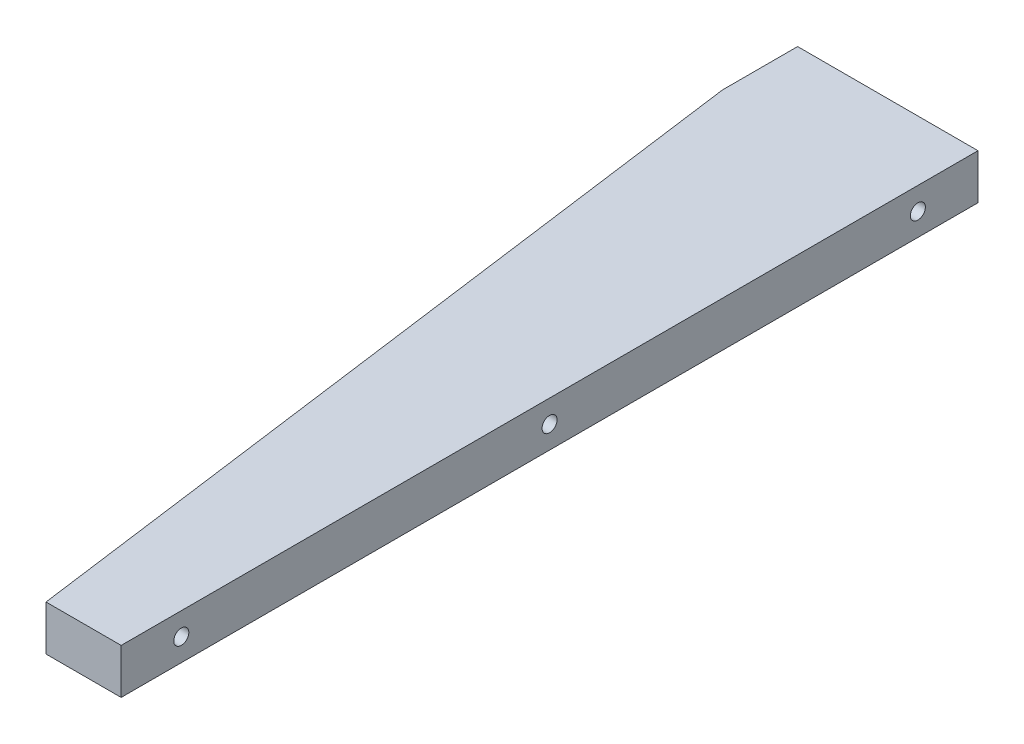
ISO-10303-21;
HEADER;
FILE_DESCRIPTION(('STEP AP214'),'2;1');
FILE_NAME('part.step','',(''),(''),'','','');
FILE_SCHEMA(('AUTOMOTIVE_DESIGN { 1 0 10303 214 1 1 1 1 }'));
ENDSEC;
DATA;
#1=APPLICATION_CONTEXT('core data for automotive mechanical design processes');
#2=APPLICATION_PROTOCOL_DEFINITION('international standard','automotive_design',2000,#1);
#3=PRODUCT_CONTEXT('',#1,'mechanical');
#4=PRODUCT('Part','Part','',(#3));
#5=PRODUCT_RELATED_PRODUCT_CATEGORY('part','',(#4));
#6=PRODUCT_DEFINITION_FORMATION('','',#4);
#7=PRODUCT_DEFINITION_CONTEXT('part definition',#1,'design');
#8=PRODUCT_DEFINITION('design','',#6,#7);
#9=PRODUCT_DEFINITION_SHAPE('','',#8);
#10=(LENGTH_UNIT() NAMED_UNIT(*) SI_UNIT(.MILLI.,.METRE.));
#11=(NAMED_UNIT(*) PLANE_ANGLE_UNIT() SI_UNIT($,.RADIAN.));
#12=(NAMED_UNIT(*) SI_UNIT($,.STERADIAN.) SOLID_ANGLE_UNIT());
#13=UNCERTAINTY_MEASURE_WITH_UNIT(LENGTH_MEASURE(1.E-05),#10,'distance_accuracy_value','');
#14=(GEOMETRIC_REPRESENTATION_CONTEXT(3) GLOBAL_UNCERTAINTY_ASSIGNED_CONTEXT((#13)) GLOBAL_UNIT_ASSIGNED_CONTEXT((#10,
#11,#12)) REPRESENTATION_CONTEXT('',''));
#15=CARTESIAN_POINT('',(0.,0.,0.));
#16=DIRECTION('',(0.,0.,1.));
#17=DIRECTION('',(1.,0.,0.));
#18=AXIS2_PLACEMENT_3D('',#15,#16,#17);
#19=CARTESIAN_POINT('',(-60.,15.,0.));
#20=DIRECTION('',(0.,0.,1.));
#21=DIRECTION('',(1.,0.,0.));
#22=AXIS2_PLACEMENT_3D('',#19,#20,#21);
#23=PLANE('',#22);
#24=CARTESIAN_POINT('',(-45.,7.5,0.));
#25=DIRECTION('',(0.,0.,-1.));
#26=DIRECTION('',(-1.,0.,0.));
#27=AXIS2_PLACEMENT_3D('',#24,#25,#26);
#28=CIRCLE('',#27,2.5);
#29=CARTESIAN_POINT('',(-47.5,7.5,0.));
#30=VERTEX_POINT('',#29);
#31=EDGE_CURVE('E151',#30,#30,#28,.T.);
#32=ORIENTED_EDGE('',*,*,#31,.F.);
#33=EDGE_LOOP('',(#32));
#34=FACE_BOUND('',#33,.T.);
#35=DIRECTION('',(-1.,0.,0.));
#36=VECTOR('',#35,1.);
#37=CARTESIAN_POINT('',(-60.,0.,0.));
#38=LINE('',#37,#36);
#39=CARTESIAN_POINT('',(0.,0.,0.));
#40=VERTEX_POINT('',#39);
#41=CARTESIAN_POINT('',(-60.,0.,0.));
#42=VERTEX_POINT('',#41);
#43=EDGE_CURVE('E113',#40,#42,#38,.T.);
#44=ORIENTED_EDGE('',*,*,#43,.T.);
#45=DIRECTION('',(0.,-1.,0.));
#46=VECTOR('',#45,1.);
#47=CARTESIAN_POINT('',(-60.,15.,0.));
#48=LINE('',#47,#46);
#49=CARTESIAN_POINT('',(-60.,15.,0.));
#50=VERTEX_POINT('',#49);
#51=EDGE_CURVE('E11',#50,#42,#48,.T.);
#52=ORIENTED_EDGE('',*,*,#51,.F.);
#53=DIRECTION('',(-1.,0.,0.));
#54=VECTOR('',#53,1.);
#55=CARTESIAN_POINT('',(-60.,15.,0.));
#56=LINE('',#55,#54);
#57=CARTESIAN_POINT('',(0.,15.,0.));
#58=VERTEX_POINT('',#57);
#59=EDGE_CURVE('E122',#58,#50,#56,.T.);
#60=ORIENTED_EDGE('',*,*,#59,.F.);
#61=DIRECTION('',(0.,-1.,0.));
#62=VECTOR('',#61,1.);
#63=CARTESIAN_POINT('',(0.,15.,0.));
#64=LINE('',#63,#62);
#65=EDGE_CURVE('E109',#58,#40,#64,.T.);
#66=ORIENTED_EDGE('',*,*,#65,.T.);
#67=EDGE_LOOP('',(#44,#52,#60,#66));
#68=FACE_BOUND('',#67,.T.);
#69=ADVANCED_FACE('F36',(#34,#68),#23,.F.);
#70=CARTESIAN_POINT('',(-60.,15.,25.));
#71=DIRECTION('',(1.,0.,0.));
#72=DIRECTION('',(0.,0.,-1.));
#73=AXIS2_PLACEMENT_3D('',#70,#71,#72);
#74=PLANE('',#73);
#75=DIRECTION('',(0.,0.,1.));
#76=VECTOR('',#75,1.);
#77=CARTESIAN_POINT('',(-60.,0.,25.));
#78=LINE('',#77,#76);
#79=CARTESIAN_POINT('',(-60.,0.,25.));
#80=VERTEX_POINT('',#79);
#81=EDGE_CURVE('E116',#42,#80,#78,.T.);
#82=ORIENTED_EDGE('',*,*,#81,.T.);
#83=DIRECTION('',(0.,-1.,0.));
#84=VECTOR('',#83,1.);
#85=CARTESIAN_POINT('',(-60.,15.,25.));
#86=LINE('',#85,#84);
#87=CARTESIAN_POINT('',(-60.,15.,25.));
#88=VERTEX_POINT('',#87);
#89=EDGE_CURVE('E44',#88,#80,#86,.T.);
#90=ORIENTED_EDGE('',*,*,#89,.F.);
#91=DIRECTION('',(0.,0.,1.));
#92=VECTOR('',#91,1.);
#93=CARTESIAN_POINT('',(-60.,15.,25.));
#94=LINE('',#93,#92);
#95=EDGE_CURVE('E87',#50,#88,#94,.T.);
#96=ORIENTED_EDGE('',*,*,#95,.F.);
#97=ORIENTED_EDGE('',*,*,#51,.T.);
#98=EDGE_LOOP('',(#82,#90,#96,#97));
#99=FACE_BOUND('',#98,.T.);
#100=ADVANCED_FACE('F144',(#99),#74,.F.);
#101=CARTESIAN_POINT('',(-25.,15.,285.));
#102=DIRECTION('',(0.991060661622862,0.,-0.133412012141539));
#103=DIRECTION('',(-0.133412012141539,0.,-0.991060661622863));
#104=AXIS2_PLACEMENT_3D('',#101,#102,#103);
#105=PLANE('',#104);
#106=DIRECTION('',(0.133412012141539,0.,0.991060661622862));
#107=VECTOR('',#106,1.);
#108=CARTESIAN_POINT('',(-25.,0.,285.));
#109=LINE('',#108,#107);
#110=CARTESIAN_POINT('',(-25.,0.,285.));
#111=VERTEX_POINT('',#110);
#112=EDGE_CURVE('E104',#80,#111,#109,.T.);
#113=ORIENTED_EDGE('',*,*,#112,.T.);
#114=DIRECTION('',(0.,-1.,0.));
#115=VECTOR('',#114,1.);
#116=CARTESIAN_POINT('',(-25.,15.,285.));
#117=LINE('',#116,#115);
#118=CARTESIAN_POINT('',(-25.,15.,285.));
#119=VERTEX_POINT('',#118);
#120=EDGE_CURVE('E101',#119,#111,#117,.T.);
#121=ORIENTED_EDGE('',*,*,#120,.F.);
#122=DIRECTION('',(0.133412012141539,0.,0.991060661622862));
#123=VECTOR('',#122,1.);
#124=CARTESIAN_POINT('',(-25.,15.,285.));
#125=LINE('',#124,#123);
#126=EDGE_CURVE('E93',#88,#119,#125,.T.);
#127=ORIENTED_EDGE('',*,*,#126,.F.);
#128=ORIENTED_EDGE('',*,*,#89,.T.);
#129=EDGE_LOOP('',(#113,#121,#127,#128));
#130=FACE_BOUND('',#129,.T.);
#131=ADVANCED_FACE('F102',(#130),#105,.F.);
#132=CARTESIAN_POINT('',(0.,15.,285.));
#133=DIRECTION('',(0.,0.,-1.));
#134=DIRECTION('',(-1.,0.,0.));
#135=AXIS2_PLACEMENT_3D('',#132,#133,#134);
#136=PLANE('',#135);
#137=DIRECTION('',(1.,0.,0.));
#138=VECTOR('',#137,1.);
#139=CARTESIAN_POINT('',(0.,0.,285.));
#140=LINE('',#139,#138);
#141=CARTESIAN_POINT('',(0.,0.,285.));
#142=VERTEX_POINT('',#141);
#143=EDGE_CURVE('E73',#111,#142,#140,.T.);
#144=ORIENTED_EDGE('',*,*,#143,.T.);
#145=DIRECTION('',(0.,-1.,0.));
#146=VECTOR('',#145,1.);
#147=CARTESIAN_POINT('',(0.,15.,285.));
#148=LINE('',#147,#146);
#149=CARTESIAN_POINT('',(0.,15.,285.));
#150=VERTEX_POINT('',#149);
#151=EDGE_CURVE('E105',#150,#142,#148,.T.);
#152=ORIENTED_EDGE('',*,*,#151,.F.);
#153=DIRECTION('',(1.,0.,0.));
#154=VECTOR('',#153,1.);
#155=CARTESIAN_POINT('',(0.,15.,285.));
#156=LINE('',#155,#154);
#157=EDGE_CURVE('E97',#119,#150,#156,.T.);
#158=ORIENTED_EDGE('',*,*,#157,.F.);
#159=ORIENTED_EDGE('',*,*,#120,.T.);
#160=EDGE_LOOP('',(#144,#152,#158,#159));
#161=FACE_BOUND('',#160,.T.);
#162=ADVANCED_FACE('F107',(#161),#136,.F.);
#163=CARTESIAN_POINT('',(0.,15.,0.));
#164=DIRECTION('',(-1.,0.,0.));
#165=DIRECTION('',(0.,0.,1.));
#166=AXIS2_PLACEMENT_3D('',#163,#164,#165);
#167=PLANE('',#166);
#168=CARTESIAN_POINT('',(0.,7.5,265.));
#169=DIRECTION('',(1.,0.,0.));
#170=DIRECTION('',(0.,0.,-1.));
#171=AXIS2_PLACEMENT_3D('',#168,#169,#170);
#172=CIRCLE('',#171,2.49999999999999);
#173=CARTESIAN_POINT('',(0.,7.5,262.5));
#174=VERTEX_POINT('',#173);
#175=EDGE_CURVE('E173',#174,#174,#172,.T.);
#176=ORIENTED_EDGE('',*,*,#175,.F.);
#177=EDGE_LOOP('',(#176));
#178=FACE_BOUND('',#177,.T.);
#179=CARTESIAN_POINT('',(0.,7.5,142.5));
#180=DIRECTION('',(1.,0.,0.));
#181=DIRECTION('',(0.,0.,-1.));
#182=AXIS2_PLACEMENT_3D('',#179,#180,#181);
#183=CIRCLE('',#182,2.49999999999999);
#184=CARTESIAN_POINT('',(0.,7.5,140.));
#185=VERTEX_POINT('',#184);
#186=EDGE_CURVE('E167',#185,#185,#183,.T.);
#187=ORIENTED_EDGE('',*,*,#186,.F.);
#188=EDGE_LOOP('',(#187));
#189=FACE_BOUND('',#188,.T.);
#190=CARTESIAN_POINT('',(0.,7.5,20.));
#191=DIRECTION('',(1.,0.,0.));
#192=DIRECTION('',(0.,0.,-1.));
#193=AXIS2_PLACEMENT_3D('',#190,#191,#192);
#194=CIRCLE('',#193,2.49999999999999);
#195=CARTESIAN_POINT('',(0.,7.5,17.5));
#196=VERTEX_POINT('',#195);
#197=EDGE_CURVE('E158',#196,#196,#194,.T.);
#198=ORIENTED_EDGE('',*,*,#197,.F.);
#199=EDGE_LOOP('',(#198));
#200=FACE_BOUND('',#199,.T.);
#201=DIRECTION('',(0.,0.,-1.));
#202=VECTOR('',#201,1.);
#203=CARTESIAN_POINT('',(0.,0.,0.));
#204=LINE('',#203,#202);
#205=EDGE_CURVE('E79',#142,#40,#204,.T.);
#206=ORIENTED_EDGE('',*,*,#205,.T.);
#207=ORIENTED_EDGE('',*,*,#65,.F.);
#208=DIRECTION('',(0.,0.,-1.));
#209=VECTOR('',#208,1.);
#210=CARTESIAN_POINT('',(0.,15.,0.));
#211=LINE('',#210,#209);
#212=EDGE_CURVE('E52',#150,#58,#211,.T.);
#213=ORIENTED_EDGE('',*,*,#212,.F.);
#214=ORIENTED_EDGE('',*,*,#151,.T.);
#215=EDGE_LOOP('',(#206,#207,#213,#214));
#216=FACE_BOUND('',#215,.T.);
#217=ADVANCED_FACE('F130',(#178,#189,#200,#216),#167,.F.);
#218=CARTESIAN_POINT('',(0.,15.,0.));
#219=DIRECTION('',(0.,-1.,0.));
#220=DIRECTION('',(0.,0.,-1.));
#221=AXIS2_PLACEMENT_3D('',#218,#219,#220);
#222=PLANE('',#221);
#223=ORIENTED_EDGE('',*,*,#59,.T.);
#224=ORIENTED_EDGE('',*,*,#95,.T.);
#225=ORIENTED_EDGE('',*,*,#126,.T.);
#226=ORIENTED_EDGE('',*,*,#157,.T.);
#227=ORIENTED_EDGE('',*,*,#212,.T.);
#228=EDGE_LOOP('',(#223,#224,#225,#226,#227));
#229=FACE_BOUND('',#228,.T.);
#230=ADVANCED_FACE('F95',(#229),#222,.F.);
#231=CARTESIAN_POINT('',(0.,0.,0.));
#232=DIRECTION('',(0.,-1.,0.));
#233=DIRECTION('',(0.,0.,-1.));
#234=AXIS2_PLACEMENT_3D('',#231,#232,#233);
#235=PLANE('',#234);
#236=ORIENTED_EDGE('',*,*,#43,.F.);
#237=ORIENTED_EDGE('',*,*,#205,.F.);
#238=ORIENTED_EDGE('',*,*,#143,.F.);
#239=ORIENTED_EDGE('',*,*,#112,.F.);
#240=ORIENTED_EDGE('',*,*,#81,.F.);
#241=EDGE_LOOP('',(#236,#237,#238,#239,#240));
#242=FACE_BOUND('',#241,.T.);
#243=ADVANCED_FACE('F126',(#242),#235,.T.);
#244=CARTESIAN_POINT('',(-45.,7.5,10.));
#245=DIRECTION('',(0.,0.,-1.));
#246=DIRECTION('',(-1.,0.,0.));
#247=AXIS2_PLACEMENT_3D('',#244,#245,#246);
#248=CONICAL_SURFACE('',#247,2.5,1.02974425867665);
#249=CARTESIAN_POINT('',(-45.,7.5,11.5021515475689));
#250=VERTEX_POINT('',#249);
#251=VERTEX_LOOP('',#250);
#252=FACE_BOUND('',#251,.T.);
#253=CARTESIAN_POINT('',(-45.,7.5,10.));
#254=DIRECTION('',(0.,0.,-1.));
#255=DIRECTION('',(-1.,0.,0.));
#256=AXIS2_PLACEMENT_3D('',#253,#254,#255);
#257=CIRCLE('',#256,2.5);
#258=CARTESIAN_POINT('',(-47.5,7.5,10.));
#259=VERTEX_POINT('',#258);
#260=EDGE_CURVE('E117',#259,#259,#257,.T.);
#261=ORIENTED_EDGE('',*,*,#260,.T.);
#262=EDGE_LOOP('',(#261));
#263=FACE_BOUND('',#262,.T.);
#264=ADVANCED_FACE('F207',(#252,#263),#248,.F.);
#265=CARTESIAN_POINT('',(-45.,7.5,0.));
#266=DIRECTION('',(0.,0.,-1.));
#267=DIRECTION('',(-1.,0.,0.));
#268=AXIS2_PLACEMENT_3D('',#265,#266,#267);
#269=CYLINDRICAL_SURFACE('',#268,2.5);
#270=ORIENTED_EDGE('',*,*,#260,.F.);
#271=EDGE_LOOP('',(#270));
#272=FACE_BOUND('',#271,.T.);
#273=ORIENTED_EDGE('',*,*,#31,.T.);
#274=EDGE_LOOP('',(#273));
#275=FACE_BOUND('',#274,.T.);
#276=ADVANCED_FACE('F203',(#272,#275),#269,.F.);
#277=CARTESIAN_POINT('',(-9.99999999999999,7.5,20.));
#278=DIRECTION('',(1.,0.,0.));
#279=DIRECTION('',(0.,0.,-1.));
#280=AXIS2_PLACEMENT_3D('',#277,#278,#279);
#281=CONICAL_SURFACE('',#280,2.49999999999999,1.02974425867665);
#282=CARTESIAN_POINT('',(-11.5021515475689,7.5,20.));
#283=VERTEX_POINT('',#282);
#284=VERTEX_LOOP('',#283);
#285=FACE_BOUND('',#284,.T.);
#286=CARTESIAN_POINT('',(-9.99999999999999,7.5,20.));
#287=DIRECTION('',(1.,0.,0.));
#288=DIRECTION('',(0.,0.,-1.));
#289=AXIS2_PLACEMENT_3D('',#286,#287,#288);
#290=CIRCLE('',#289,2.49999999999999);
#291=CARTESIAN_POINT('',(-9.99999999999999,7.5,17.5));
#292=VERTEX_POINT('',#291);
#293=EDGE_CURVE('E153',#292,#292,#290,.T.);
#294=ORIENTED_EDGE('',*,*,#293,.T.);
#295=EDGE_LOOP('',(#294));
#296=FACE_BOUND('',#295,.T.);
#297=ADVANCED_FACE('F199',(#285,#296),#281,.F.);
#298=CARTESIAN_POINT('',(0.,7.5,20.));
#299=DIRECTION('',(1.,0.,0.));
#300=DIRECTION('',(0.,0.,-1.));
#301=AXIS2_PLACEMENT_3D('',#298,#299,#300);
#302=CYLINDRICAL_SURFACE('',#301,2.49999999999999);
#303=ORIENTED_EDGE('',*,*,#293,.F.);
#304=EDGE_LOOP('',(#303));
#305=FACE_BOUND('',#304,.T.);
#306=ORIENTED_EDGE('',*,*,#197,.T.);
#307=EDGE_LOOP('',(#306));
#308=FACE_BOUND('',#307,.T.);
#309=ADVANCED_FACE('F195',(#305,#308),#302,.F.);
#310=CARTESIAN_POINT('',(-9.99999999999998,7.5,142.5));
#311=DIRECTION('',(1.,0.,0.));
#312=DIRECTION('',(0.,0.,-1.));
#313=AXIS2_PLACEMENT_3D('',#310,#311,#312);
#314=CONICAL_SURFACE('',#313,2.49999999999999,1.02974425867665);
#315=CARTESIAN_POINT('',(-11.5021515475689,7.5,142.5));
#316=VERTEX_POINT('',#315);
#317=VERTEX_LOOP('',#316);
#318=FACE_BOUND('',#317,.T.);
#319=CARTESIAN_POINT('',(-9.99999999999998,7.5,142.5));
#320=DIRECTION('',(1.,0.,0.));
#321=DIRECTION('',(0.,0.,-1.));
#322=AXIS2_PLACEMENT_3D('',#319,#320,#321);
#323=CIRCLE('',#322,2.49999999999999);
#324=CARTESIAN_POINT('',(-9.99999999999998,7.5,140.));
#325=VERTEX_POINT('',#324);
#326=EDGE_CURVE('E164',#325,#325,#323,.T.);
#327=ORIENTED_EDGE('',*,*,#326,.T.);
#328=EDGE_LOOP('',(#327));
#329=FACE_BOUND('',#328,.T.);
#330=ADVANCED_FACE('F191',(#318,#329),#314,.F.);
#331=CARTESIAN_POINT('',(0.,7.5,142.5));
#332=DIRECTION('',(1.,0.,0.));
#333=DIRECTION('',(0.,0.,-1.));
#334=AXIS2_PLACEMENT_3D('',#331,#332,#333);
#335=CYLINDRICAL_SURFACE('',#334,2.49999999999999);
#336=ORIENTED_EDGE('',*,*,#326,.F.);
#337=EDGE_LOOP('',(#336));
#338=FACE_BOUND('',#337,.T.);
#339=ORIENTED_EDGE('',*,*,#186,.T.);
#340=EDGE_LOOP('',(#339));
#341=FACE_BOUND('',#340,.T.);
#342=ADVANCED_FACE('F184',(#338,#341),#335,.F.);
#343=CARTESIAN_POINT('',(-9.99999999999996,7.5,265.));
#344=DIRECTION('',(1.,0.,0.));
#345=DIRECTION('',(0.,0.,-1.));
#346=AXIS2_PLACEMENT_3D('',#343,#344,#345);
#347=CONICAL_SURFACE('',#346,2.49999999999999,1.02974425867665);
#348=CARTESIAN_POINT('',(-11.5021515475689,7.5,265.));
#349=VERTEX_POINT('',#348);
#350=VERTEX_LOOP('',#349);
#351=FACE_BOUND('',#350,.T.);
#352=CARTESIAN_POINT('',(-9.99999999999996,7.5,265.));
#353=DIRECTION('',(1.,0.,0.));
#354=DIRECTION('',(0.,0.,-1.));
#355=AXIS2_PLACEMENT_3D('',#352,#353,#354);
#356=CIRCLE('',#355,2.49999999999999);
#357=CARTESIAN_POINT('',(-9.99999999999996,7.5,262.5));
#358=VERTEX_POINT('',#357);
#359=EDGE_CURVE('E170',#358,#358,#356,.T.);
#360=ORIENTED_EDGE('',*,*,#359,.T.);
#361=EDGE_LOOP('',(#360));
#362=FACE_BOUND('',#361,.T.);
#363=ADVANCED_FACE('F178',(#351,#362),#347,.F.);
#364=CARTESIAN_POINT('',(0.,7.5,265.));
#365=DIRECTION('',(1.,0.,0.));
#366=DIRECTION('',(0.,0.,-1.));
#367=AXIS2_PLACEMENT_3D('',#364,#365,#366);
#368=CYLINDRICAL_SURFACE('',#367,2.49999999999999);
#369=ORIENTED_EDGE('',*,*,#359,.F.);
#370=EDGE_LOOP('',(#369));
#371=FACE_BOUND('',#370,.T.);
#372=ORIENTED_EDGE('',*,*,#175,.T.);
#373=EDGE_LOOP('',(#372));
#374=FACE_BOUND('',#373,.T.);
#375=ADVANCED_FACE('F176',(#371,#374),#368,.F.);
#376=CLOSED_SHELL('',(#69,#100,#131,#162,#217,#230,#243,#264,#276,#297,#309,#330,#342,#363,#375));
#377=MANIFOLD_SOLID_BREP('B2',#376);
#378=ADVANCED_BREP_SHAPE_REPRESENTATION('',(#18,#377),#14);
#379=SHAPE_DEFINITION_REPRESENTATION(#9,#378);
ENDSEC;
END-ISO-10303-21;
